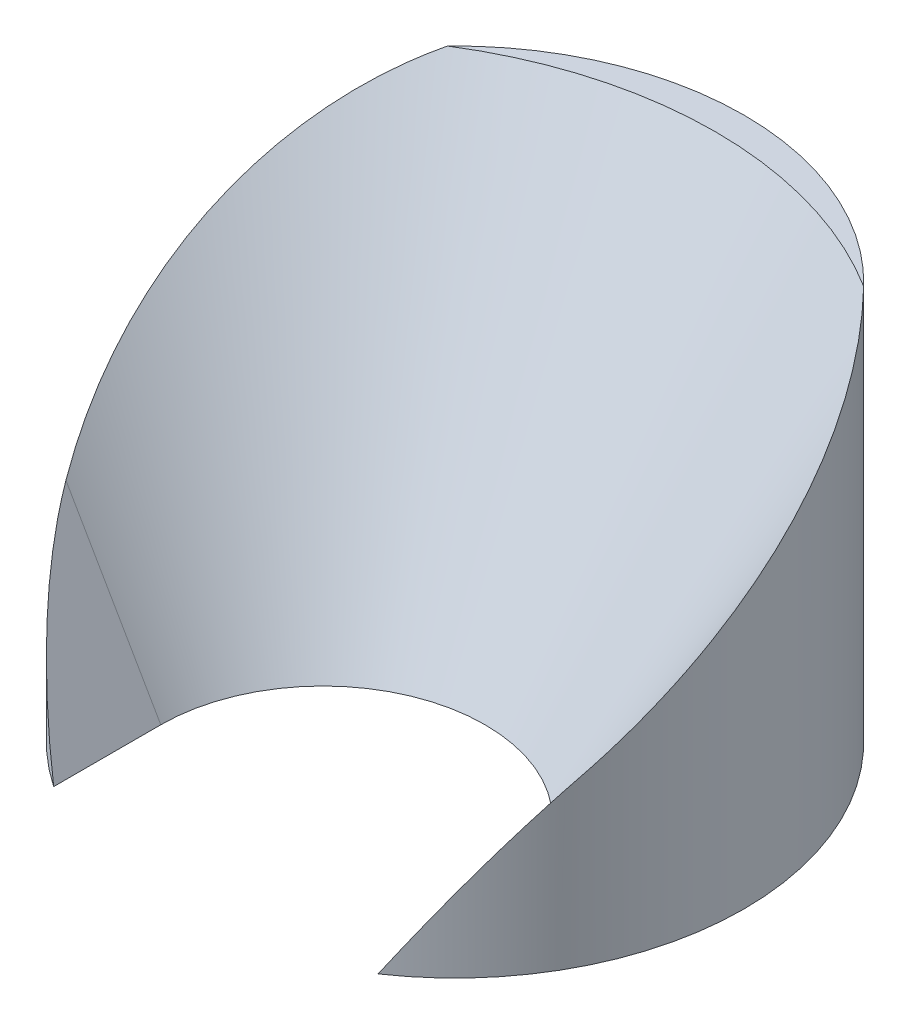
ISO-10303-21;
HEADER;
FILE_DESCRIPTION(('STEP AP214'),'2;1');
FILE_NAME('part.step','',(''),(''),'','','');
FILE_SCHEMA(('AUTOMOTIVE_DESIGN { 1 0 10303 214 1 1 1 1 }'));
ENDSEC;
DATA;
#1=APPLICATION_CONTEXT('core data for automotive mechanical design processes');
#2=APPLICATION_PROTOCOL_DEFINITION('international standard','automotive_design',2000,#1);
#3=PRODUCT_CONTEXT('',#1,'mechanical');
#4=PRODUCT('Part','Part','',(#3));
#5=PRODUCT_RELATED_PRODUCT_CATEGORY('part','',(#4));
#6=PRODUCT_DEFINITION_FORMATION('','',#4);
#7=PRODUCT_DEFINITION_CONTEXT('part definition',#1,'design');
#8=PRODUCT_DEFINITION('design','',#6,#7);
#9=PRODUCT_DEFINITION_SHAPE('','',#8);
#10=(LENGTH_UNIT() NAMED_UNIT(*) SI_UNIT(.MILLI.,.METRE.));
#11=(NAMED_UNIT(*) PLANE_ANGLE_UNIT() SI_UNIT($,.RADIAN.));
#12=(NAMED_UNIT(*) SI_UNIT($,.STERADIAN.) SOLID_ANGLE_UNIT());
#13=UNCERTAINTY_MEASURE_WITH_UNIT(LENGTH_MEASURE(1.E-05),#10,'distance_accuracy_value','');
#14=(GEOMETRIC_REPRESENTATION_CONTEXT(3) GLOBAL_UNCERTAINTY_ASSIGNED_CONTEXT((#13)) GLOBAL_UNIT_ASSIGNED_CONTEXT((#10,
#11,#12)) REPRESENTATION_CONTEXT('',''));
#15=CARTESIAN_POINT('',(0.,0.,0.));
#16=DIRECTION('',(0.,0.,1.));
#17=DIRECTION('',(1.,0.,0.));
#18=AXIS2_PLACEMENT_3D('',#15,#16,#17);
#19=CARTESIAN_POINT('',(0.,25.4,0.));
#20=DIRECTION('',(0.,-1.,0.));
#21=DIRECTION('',(0.,0.,-1.));
#22=AXIS2_PLACEMENT_3D('',#19,#20,#21);
#23=CYLINDRICAL_SURFACE('',#22,18.415);
#24=CARTESIAN_POINT('',(0.,0.,0.));
#25=DIRECTION('',(0.,1.,0.));
#26=DIRECTION('',(0.,0.,1.));
#27=AXIS2_PLACEMENT_3D('',#24,#25,#26);
#28=CIRCLE('',#27,18.415);
#29=CARTESIAN_POINT('',(10.3353031625838,0.,15.2411854374089));
#30=VERTEX_POINT('',#29);
#31=CARTESIAN_POINT('',(-10.3353031625838,0.,15.2411854374089));
#32=VERTEX_POINT('',#31);
#33=EDGE_CURVE('E83',#30,#32,#28,.T.);
#34=ORIENTED_EDGE('',*,*,#33,.T.);
#35=CARTESIAN_POINT('',(0.,-17.9012701892226,0.));
#36=DIRECTION('',(-0.866025403784441,-0.499999999999997,0.));
#37=DIRECTION('',(0.499999999999997,-0.866025403784441,0.));
#38=AXIS2_PLACEMENT_3D('',#35,#36,#37);
#39=ELLIPSE('',#38,36.8300000000003,18.415);
#40=CARTESIAN_POINT('',(-16.379865689315,10.4694894058255,8.415));
#41=VERTEX_POINT('',#40);
#42=EDGE_CURVE('E117',#32,#41,#39,.T.);
#43=ORIENTED_EDGE('',*,*,#42,.T.);
#44=CARTESIAN_POINT('',(-16.379865689315,10.4694894058255,8.415));
#45=CARTESIAN_POINT('',(-16.5286648509305,10.7272329496705,8.12535187265898));
#46=CARTESIAN_POINT('',(-16.6697915106606,10.9849633280739,7.83175456951879));
#47=CARTESIAN_POINT('',(-16.9364013528266,11.4999965099082,7.23717708553724));
#48=CARTESIAN_POINT('',(-17.0618845752888,11.7572993144314,6.93619692358846));
#49=CARTESIAN_POINT('',(-17.2969642565591,12.2711963983848,6.3272267273686));
#50=CARTESIAN_POINT('',(-17.406553330949,12.5277902944949,6.01923351122855));
#51=CARTESIAN_POINT('',(-17.6094348607851,13.0397450476619,5.39695985430235));
#52=CARTESIAN_POINT('',(-17.7027269030696,13.2951058732986,5.08267925434374));
#53=CARTESIAN_POINT('',(-17.9591717658886,14.0634554223923,4.12543541831482));
#54=CARTESIAN_POINT('',(-18.0968006386472,14.5741570175167,3.47346985999));
#55=CARTESIAN_POINT('',(-18.2499986220877,15.3328711041379,2.48226039078521));
#56=CARTESIAN_POINT('',(-18.2921898395877,15.5845438933651,2.14965915843067));
#57=CARTESIAN_POINT('',(-18.3584690920134,16.0852753365215,1.48050611060642));
#58=CARTESIAN_POINT('',(-18.3825507815228,16.3343330440373,1.14395295232869));
#59=CARTESIAN_POINT('',(-18.4265180937325,17.0692399505322,0.140109433150779));
#60=CARTESIAN_POINT('',(-18.4197384391971,17.5507449435937,-0.53173384843927));
#61=CARTESIAN_POINT('',(-18.3311488711509,18.4988483672521,-1.88097872676906));
#62=CARTESIAN_POINT('',(-18.2493508814137,18.9654491545986,-2.55837942322945));
#63=CARTESIAN_POINT('',(-18.0686529247627,19.6504345882498,-3.57110940061273));
#64=CARTESIAN_POINT('',(-17.9990200928277,19.8756862412662,-3.90721722258782));
#65=CARTESIAN_POINT('',(-17.840210427432,20.3212991967059,-4.57797315475934));
#66=CARTESIAN_POINT('',(-17.7510385079831,20.5416617134118,-4.91262161043733));
#67=CARTESIAN_POINT('',(-17.552864997506,20.9770853703276,-5.57943716189015));
#68=CARTESIAN_POINT('',(-17.4438657025264,21.1921471211055,-5.9116045403466));
#69=CARTESIAN_POINT('',(-17.2058000438245,21.6165389247639,-6.57236773076279));
#70=CARTESIAN_POINT('',(-17.0767338577059,21.8258690283536,-6.90096357430515));
#71=CARTESIAN_POINT('',(-16.7263048078467,22.3450375442893,-7.72220429331479));
#72=CARTESIAN_POINT('',(-16.4917248601533,22.6508805649234,-8.21182253156751));
#73=CARTESIAN_POINT('',(-15.9756323598818,23.2464386616087,-9.17551812527952));
#74=CARTESIAN_POINT('',(-15.6941401460858,23.5361606546252,-9.64960210947826));
#75=CARTESIAN_POINT('',(-15.0816036335799,24.1001545629839,-10.581624059408));
#76=CARTESIAN_POINT('',(-14.750172756621,24.3742806758766,-11.0393981873883));
#77=CARTESIAN_POINT('',(-14.2176047990294,24.7704518444061,-11.7069719217575));
#78=CARTESIAN_POINT('',(-14.034045834396,24.9000863907834,-11.926453628446));
#79=CARTESIAN_POINT('',(-13.6552575997814,25.1540690781988,-12.3583435773394));
#80=CARTESIAN_POINT('',(-13.4600268895344,25.278416563573,-12.5707509415309));
#81=CARTESIAN_POINT('',(-13.2590279166941,25.4,-12.7792959001788));
#82=B_SPLINE_CURVE_WITH_KNOTS('',3,(#44,#45,#46,#47,#48,#49,#50,#51,#52,#53,#54,#55,#56,#57,#58,
#59,#60,#61,#62,#63,#64,#65,#66,#67,#68,#69,#70,#71,#72,#73,#74,#75,#76,#77,#78,#79,#80,#81),
.UNSPECIFIED.,.F.,.F.,(4,2,2,2,2,2,2,2,2,2,2,2,2,2,2,2,2,2,4),(0.,1.2457850324858,
2.49156687736735,3.73792567080494,4.98431605729996,7.49913149860225,8.75644943420417,
10.0142077177346,12.4904251833268,14.9662491352472,16.1975007423578,17.4284430487221,
18.6592429002215,19.890031859051,21.7572082710113,23.6235772658052,25.5052163776891,
26.4472787433801,27.3894575982471),.UNSPECIFIED.);
#83=CARTESIAN_POINT('',(-13.2590279166941,25.4,-12.7792959001788));
#84=VERTEX_POINT('',#83);
#85=EDGE_CURVE('E88',#41,#84,#82,.T.);
#86=ORIENTED_EDGE('',*,*,#85,.T.);
#87=CARTESIAN_POINT('',(0.,25.4,0.));
#88=DIRECTION('',(0.,1.,0.));
#89=DIRECTION('',(0.,0.,1.));
#90=AXIS2_PLACEMENT_3D('',#87,#88,#89);
#91=CIRCLE('',#90,18.415);
#92=CARTESIAN_POINT('',(13.2590279166941,25.4,-12.7792959001788));
#93=VERTEX_POINT('',#92);
#94=EDGE_CURVE('E91',#93,#84,#91,.T.);
#95=ORIENTED_EDGE('',*,*,#94,.F.);
#96=CARTESIAN_POINT('',(13.2590279166941,25.4,-12.7792959001788));
#97=CARTESIAN_POINT('',(13.4885416148047,25.2611681444452,-12.54116568398));
#98=CARTESIAN_POINT('',(13.7105266658344,25.1187366600325,-12.2980070007856));
#99=CARTESIAN_POINT('',(14.1392421400875,24.8270333593593,-11.8026004075184));
#100=CARTESIAN_POINT('',(14.3459751929586,24.6777627294866,-11.5503540754916));
#101=CARTESIAN_POINT('',(14.9425398599756,24.2205975881522,-10.7820498232544));
#102=CARTESIAN_POINT('',(15.3094015501498,23.902946387628,-10.2537326299539));
#103=CARTESIAN_POINT('',(15.9779773160519,23.2474940547396,-9.17688354178689));
#104=CARTESIAN_POINT('',(16.2801899906707,22.9098748334872,-8.62854761085928));
#105=CARTESIAN_POINT('',(16.8235156799073,22.2147405388295,-7.51436324397878));
#106=CARTESIAN_POINT('',(17.0646179174311,21.8572219696263,-6.94851173879422));
#107=CARTESIAN_POINT('',(17.4553657864797,21.1788715593105,-5.89000982840331));
#108=CARTESIAN_POINT('',(17.6132523609215,20.8603951324961,-5.39885732222089));
#109=CARTESIAN_POINT('',(17.8859542947124,20.2123247289689,-4.41211749408255));
#110=CARTESIAN_POINT('',(18.0007784804833,19.8827330456423,-3.91653110227733));
#111=CARTESIAN_POINT('',(18.1885067692319,19.2132494515027,-2.92339094887312));
#112=CARTESIAN_POINT('',(18.2613522122618,18.8733438225977,-2.42583540779888));
#113=CARTESIAN_POINT('',(18.3660049821511,18.1848946690489,-1.43235133761508));
#114=CARTESIAN_POINT('',(18.3978072997883,17.8363500953309,-0.936423014469953));
#115=CARTESIAN_POINT('',(18.423609780727,17.0707115650348,0.136752695887499));
#116=CARTESIAN_POINT('',(18.4100975405153,16.6522124148833,0.713187055193505));
#117=CARTESIAN_POINT('',(18.3301712331431,15.8068074955531,1.85616120092222));
#118=CARTESIAN_POINT('',(18.2637508046771,15.3799007215212,2.42269978917662));
#119=CARTESIAN_POINT('',(18.0799513670088,14.5193276206801,3.5425506256729));
#120=CARTESIAN_POINT('',(17.9625523039792,14.0856586985871,4.09585757842699));
#121=CARTESIAN_POINT('',(17.6787035170126,13.213530426136,5.18583318917613));
#122=CARTESIAN_POINT('',(17.5122525721867,12.7750709568038,5.72250143267044));
#123=CARTESIAN_POINT('',(17.1084287710827,11.8405250628315,6.84181978089711));
#124=CARTESIAN_POINT('',(16.8648140585124,11.3440465663273,7.42189952462932));
#125=CARTESIAN_POINT('',(16.3199685395544,10.3501912011904,8.55367883591332));
#126=CARTESIAN_POINT('',(16.0187285337799,9.85281420169438,9.10537385421695));
#127=CARTESIAN_POINT('',(15.3602304826867,8.86032735638188,10.1769971402298));
#128=CARTESIAN_POINT('',(15.0029471830587,8.36521863672536,10.6969109391432));
#129=CARTESIAN_POINT('',(14.2336214037892,7.38163340346481,11.7011237360393));
#130=CARTESIAN_POINT('',(13.8215923473239,6.8931552963489,12.1854314192558));
#131=CARTESIAN_POINT('',(13.0347434295509,6.02882563789938,13.0178214881597));
#132=CARTESIAN_POINT('',(12.6701035861601,5.6507444967937,13.3732400477127));
#133=CARTESIAN_POINT('',(11.9063028856617,4.90543124350779,14.0575664469551));
#134=CARTESIAN_POINT('',(11.5071395085461,4.53819992592792,14.3864723479906));
#135=CARTESIAN_POINT('',(10.67410384385,3.81966853002471,15.0149110196159));
#136=CARTESIAN_POINT('',(10.2402858894954,3.46834481535142,15.3144881933778));
#137=CARTESIAN_POINT('',(9.56245815468817,2.95772630776729,15.7398439975823));
#138=CARTESIAN_POINT('',(9.33202313232513,2.79026388373371,15.8776150505761));
#139=CARTESIAN_POINT('',(8.86188573925736,2.46175700506419,16.1447299599308));
#140=CARTESIAN_POINT('',(8.62218410844694,2.30071204010149,16.2740744869041));
#141=CARTESIAN_POINT('',(8.07102864738644,1.94609188044315,16.5556444270191));
#142=CARTESIAN_POINT('',(7.7568534876564,1.75468250181965,16.7053033275143));
#143=CARTESIAN_POINT('',(7.11333861218883,1.38648477197055,16.989299903801));
#144=CARTESIAN_POINT('',(6.78399969680074,1.20969565045559,17.1236383869125));
#145=CARTESIAN_POINT('',(6.11042984054389,0.874200314020705,17.3753846004279));
#146=CARTESIAN_POINT('',(5.76621600188374,0.715474056674089,17.4928111354188));
#147=CARTESIAN_POINT('',(5.06297657790074,0.419773748485304,17.7091417670637));
#148=CARTESIAN_POINT('',(4.70395681383366,0.28279124944035,17.8080530602211));
#149=CARTESIAN_POINT('',(4.04656497954209,0.0600505700496701,17.9674011774119));
#150=CARTESIAN_POINT('',(3.75070791125625,-0.0304595868257819,18.0315716447625));
#151=CARTESIAN_POINT('',(3.15123217490149,-0.1927526758408,18.1459368799699));
#152=CARTESIAN_POINT('',(2.8476143995317,-0.26453775134099,18.1961332474121));
#153=CARTESIAN_POINT('',(2.23446624670318,-0.387227793739197,18.2815497449969));
#154=CARTESIAN_POINT('',(1.92494348735159,-0.438157980677734,18.3167879660887));
#155=CARTESIAN_POINT('',(1.30162988655499,-0.517581212672963,18.3716042617505));
#156=CARTESIAN_POINT('',(0.987839079319801,-0.546074437461719,18.3911824617658));
#157=CARTESIAN_POINT('',(0.356981078886901,-0.579670507724684,18.4142568189362));
#158=CARTESIAN_POINT('',(0.0399054918014733,-0.58466728709299,18.4176800506469));
#159=CARTESIAN_POINT('',(-0.593465187138752,-0.570793787625229,18.4081596772341));
#160=CARTESIAN_POINT('',(-0.909760288238547,-0.551923792868341,18.3952162669179));
#161=CARTESIAN_POINT('',(-1.53921573467822,-0.490998948712356,18.3532723617578));
#162=CARTESIAN_POINT('',(-1.85237395625405,-0.448929347502137,18.3242616502331));
#163=CARTESIAN_POINT('',(-2.47314591862411,-0.343060543449173,18.250849803112));
#164=CARTESIAN_POINT('',(-2.78075900864777,-0.279258807404128,18.2064468733137));
#165=CARTESIAN_POINT('',(-3.45342624101736,-0.116201218918089,18.0921499132565));
#166=CARTESIAN_POINT('',(-3.81677221432216,-0.0122897235384492,18.0188419574222));
#167=CARTESIAN_POINT('',(-4.53071530721974,0.220635549584496,17.8527115655056));
#168=CARTESIAN_POINT('',(-4.88130863996753,0.349656712472445,17.7598833875735));
#169=CARTESIAN_POINT('',(-5.56976523352129,0.629290885476436,17.5561746673093));
#170=CARTESIAN_POINT('',(-5.90758078658471,0.779976326735384,17.4452333908147));
#171=CARTESIAN_POINT('',(-6.56876414897129,1.09894756261476,17.2071794695874));
#172=CARTESIAN_POINT('',(-6.89213392978228,1.26723094501745,17.0800690407072));
#173=CARTESIAN_POINT('',(-7.45986333054752,1.5824033943982,16.8385689221168));
#174=CARTESIAN_POINT('',(-7.70686804383717,1.72663967884468,16.7268855732055));
#175=CARTESIAN_POINT('',(-8.1918856736426,2.02294277842249,16.4947719747614));
#176=CARTESIAN_POINT('',(-8.4298989252448,2.17500930124284,16.3743420516785));
#177=CARTESIAN_POINT('',(-8.894832544676,2.48430532299405,16.1264669458192));
#178=CARTESIAN_POINT('',(-9.12183776269016,2.64147087794485,15.9991006294137));
#179=CARTESIAN_POINT('',(-9.56728404223023,2.96136228972881,15.7367722313306));
#180=CARTESIAN_POINT('',(-9.78572726160608,3.12408672597495,15.6018120846556));
#181=CARTESIAN_POINT('',(-10.,3.28914401970216,15.4632540236523));
#182=B_SPLINE_CURVE_WITH_KNOTS('',3,(#96,#97,#98,#99,#100,#101,#102,#103,#104,#105,#106,#107,
#108,#109,#110,#111,#112,#113,#114,#115,#116,#117,#118,#119,#120,#121,#122,#123,#124,#125,#126,
#127,#128,#129,#130,#131,#132,#133,#134,#135,#136,#137,#138,#139,#140,#141,#142,#143,#144,#145,
#146,#147,#148,#149,#150,#151,#152,#153,#154,#155,#156,#157,#158,#159,#160,#161,#162,#163,#164,
#165,#166,#167,#168,#169,#170,#171,#172,#173,#174,#175,#176,#177,#178,#179,#180,#181),
.UNSPECIFIED.,.F.,.F.,(4,2,2,2,2,2,2,2,2,2,2,2,2,2,2,2,2,2,2,2,2,2,2,2,2,2,2,2,2,2,2,2,2,2,2,2,
2,2,2,2,2,2,4),(0.,1.07577336956001,2.15136082588841,4.29942479357222,6.43027173720614,
8.5614942040066,10.3787197599156,12.1955726384719,14.0149582194878,15.8345658314755,
17.9697415413307,20.1051740083321,22.2414472676327,24.3777737027218,26.7795017607102,
29.1816135545639,31.5848109176555,33.9874201216147,35.8886160678785,37.7899509071864,
39.6883611378082,40.6373767921279,41.5863168279642,42.7770274346014,43.9676752669102,
45.1569888105531,46.3458391276369,47.292911606774,48.2398756319363,49.1856910770365,
50.1314989455722,51.0815722452161,52.0316342365239,52.982301036471,53.9330786886626,
55.0862041180169,56.2396692134848,57.397084512768,58.5543413681109,59.4751768318035,
60.3959779446325,61.3078978248077,62.2195863795815),.UNSPECIFIED.);
#183=CARTESIAN_POINT('',(16.379865689315,10.4694894058255,8.415));
#184=VERTEX_POINT('',#183);
#185=EDGE_CURVE('E87',#93,#184,#182,.T.);
#186=ORIENTED_EDGE('',*,*,#185,.T.);
#187=CARTESIAN_POINT('',(0.,-17.9012701892226,0.));
#188=DIRECTION('',(-0.866025403784441,0.499999999999997,0.));
#189=DIRECTION('',(-0.499999999999997,-0.866025403784441,0.));
#190=AXIS2_PLACEMENT_3D('',#187,#188,#189);
#191=ELLIPSE('',#190,36.8300000000003,18.415);
#192=EDGE_CURVE('E76',#184,#30,#191,.F.);
#193=ORIENTED_EDGE('',*,*,#192,.T.);
#194=EDGE_LOOP('',(#34,#43,#86,#95,#186,#193));
#195=FACE_BOUND('',#194,.T.);
#196=ADVANCED_FACE('F35',(#195),#23,.T.);
#197=CARTESIAN_POINT('',(0.,25.4,0.));
#198=DIRECTION('',(0.,1.,0.));
#199=DIRECTION('',(0.,0.,1.));
#200=AXIS2_PLACEMENT_3D('',#197,#198,#199);
#201=PLANE('',#200);
#202=ORIENTED_EDGE('',*,*,#94,.T.);
#203=CARTESIAN_POINT('',(0.,25.4,8.415));
#204=DIRECTION('',(0.,1.,0.));
#205=DIRECTION('',(0.,0.,1.));
#206=AXIS2_PLACEMENT_3D('',#203,#204,#205);
#207=CIRCLE('',#206,25.0000000000002);
#208=EDGE_CURVE('E11',#84,#93,#207,.F.);
#209=ORIENTED_EDGE('',*,*,#208,.T.);
#210=EDGE_LOOP('',(#202,#209));
#211=FACE_BOUND('',#210,.T.);
#212=ADVANCED_FACE('F109',(#211),#201,.T.);
#213=CARTESIAN_POINT('',(0.,0.,0.));
#214=DIRECTION('',(0.,1.,0.));
#215=DIRECTION('',(0.,0.,1.));
#216=AXIS2_PLACEMENT_3D('',#213,#214,#215);
#217=PLANE('',#216);
#218=ORIENTED_EDGE('',*,*,#33,.F.);
#219=DIRECTION('',(0.,0.,-1.));
#220=VECTOR('',#219,1.);
#221=CARTESIAN_POINT('',(10.3353031625838,0.,0.));
#222=LINE('',#221,#220);
#223=CARTESIAN_POINT('',(10.3353031625838,0.,8.415));
#224=VERTEX_POINT('',#223);
#225=EDGE_CURVE('E44',#30,#224,#222,.T.);
#226=ORIENTED_EDGE('',*,*,#225,.T.);
#227=CARTESIAN_POINT('',(0.,0.,8.415));
#228=DIRECTION('',(0.,1.,0.));
#229=DIRECTION('',(0.,0.,1.));
#230=AXIS2_PLACEMENT_3D('',#227,#228,#229);
#231=CIRCLE('',#230,10.3353031625838);
#232=CARTESIAN_POINT('',(-10.3353031625838,0.,8.415));
#233=VERTEX_POINT('',#232);
#234=EDGE_CURVE('E52',#224,#233,#231,.T.);
#235=ORIENTED_EDGE('',*,*,#234,.T.);
#236=DIRECTION('',(0.,0.,-1.));
#237=VECTOR('',#236,1.);
#238=CARTESIAN_POINT('',(-10.3353031625838,0.,0.));
#239=LINE('',#238,#237);
#240=EDGE_CURVE('E79',#233,#32,#239,.F.);
#241=ORIENTED_EDGE('',*,*,#240,.T.);
#242=EDGE_LOOP('',(#218,#226,#235,#241));
#243=FACE_BOUND('',#242,.T.);
#244=ADVANCED_FACE('F90',(#243),#217,.F.);
#245=CARTESIAN_POINT('',(-10.,-0.580762113533719,0.));
#246=DIRECTION('',(-0.866025403784441,-0.499999999999997,0.));
#247=DIRECTION('',(0.,0.,1.));
#248=AXIS2_PLACEMENT_3D('',#245,#246,#247);
#249=PLANE('',#248);
#250=ORIENTED_EDGE('',*,*,#42,.F.);
#251=ORIENTED_EDGE('',*,*,#240,.F.);
#252=DIRECTION('',(0.499999999999997,-0.866025403784441,0.));
#253=VECTOR('',#252,1.);
#254=CARTESIAN_POINT('',(-25.0000000000002,25.4,8.415));
#255=LINE('',#254,#253);
#256=EDGE_CURVE('E39',#41,#233,#255,.T.);
#257=ORIENTED_EDGE('',*,*,#256,.F.);
#258=EDGE_LOOP('',(#250,#251,#257));
#259=FACE_BOUND('',#258,.T.);
#260=ADVANCED_FACE('F37',(#259),#249,.F.);
#261=CARTESIAN_POINT('',(0.,-0.580762113533719,8.415));
#262=DIRECTION('',(0.,1.,0.));
#263=DIRECTION('',(0.,0.,1.));
#264=AXIS2_PLACEMENT_3D('',#261,#262,#263);
#265=CONICAL_SURFACE('',#264,10.,0.523598775598295);
#266=DIRECTION('',(-0.499999999999997,-0.866025403784441,0.));
#267=VECTOR('',#266,1.);
#268=CARTESIAN_POINT('',(25.0000000000002,25.4,8.415));
#269=LINE('',#268,#267);
#270=EDGE_CURVE('E78',#184,#224,#269,.T.);
#271=ORIENTED_EDGE('',*,*,#270,.F.);
#272=ORIENTED_EDGE('',*,*,#185,.F.);
#273=ORIENTED_EDGE('',*,*,#208,.F.);
#274=ORIENTED_EDGE('',*,*,#85,.F.);
#275=ORIENTED_EDGE('',*,*,#256,.T.);
#276=ORIENTED_EDGE('',*,*,#234,.F.);
#277=EDGE_LOOP('',(#271,#272,#273,#274,#275,#276));
#278=FACE_BOUND('',#277,.T.);
#279=ADVANCED_FACE('F103',(#278),#265,.F.);
#280=CARTESIAN_POINT('',(25.0000000000002,25.4,0.));
#281=DIRECTION('',(-0.866025403784441,0.499999999999997,0.));
#282=DIRECTION('',(0.,0.,-1.));
#283=AXIS2_PLACEMENT_3D('',#280,#281,#282);
#284=PLANE('',#283);
#285=ORIENTED_EDGE('',*,*,#192,.F.);
#286=ORIENTED_EDGE('',*,*,#270,.T.);
#287=ORIENTED_EDGE('',*,*,#225,.F.);
#288=EDGE_LOOP('',(#285,#286,#287));
#289=FACE_BOUND('',#288,.T.);
#290=ADVANCED_FACE('F75',(#289),#284,.T.);
#291=CLOSED_SHELL('',(#196,#212,#244,#260,#279,#290));
#292=MANIFOLD_SOLID_BREP('B2',#291);
#293=ADVANCED_BREP_SHAPE_REPRESENTATION('',(#18,#292),#14);
#294=SHAPE_DEFINITION_REPRESENTATION(#9,#293);
ENDSEC;
END-ISO-10303-21;
